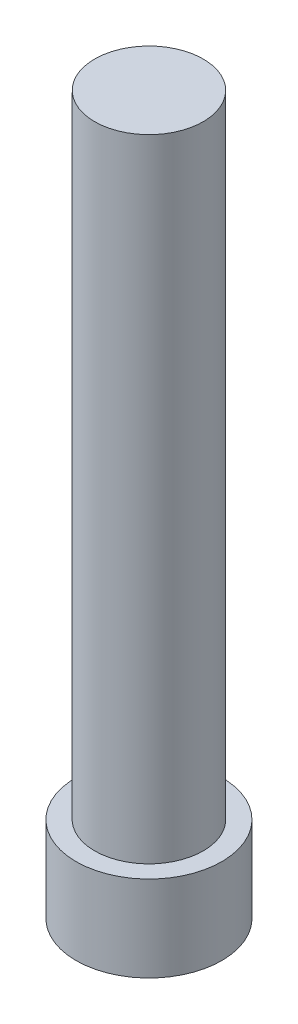
ISO-10303-21;
HEADER;
FILE_DESCRIPTION(('STEP AP214'),'2;1');
FILE_NAME('part.step','',(''),(''),'','','');
FILE_SCHEMA(('AUTOMOTIVE_DESIGN { 1 0 10303 214 1 1 1 1 }'));
ENDSEC;
DATA;
#1=APPLICATION_CONTEXT('core data for automotive mechanical design processes');
#2=APPLICATION_PROTOCOL_DEFINITION('international standard','automotive_design',2000,#1);
#3=PRODUCT_CONTEXT('',#1,'mechanical');
#4=PRODUCT('Part','Part','',(#3));
#5=PRODUCT_RELATED_PRODUCT_CATEGORY('part','',(#4));
#6=PRODUCT_DEFINITION_FORMATION('','',#4);
#7=PRODUCT_DEFINITION_CONTEXT('part definition',#1,'design');
#8=PRODUCT_DEFINITION('design','',#6,#7);
#9=PRODUCT_DEFINITION_SHAPE('','',#8);
#10=(LENGTH_UNIT() NAMED_UNIT(*) SI_UNIT(.MILLI.,.METRE.));
#11=(NAMED_UNIT(*) PLANE_ANGLE_UNIT() SI_UNIT($,.RADIAN.));
#12=(NAMED_UNIT(*) SI_UNIT($,.STERADIAN.) SOLID_ANGLE_UNIT());
#13=UNCERTAINTY_MEASURE_WITH_UNIT(LENGTH_MEASURE(1.E-05),#10,'distance_accuracy_value','');
#14=(GEOMETRIC_REPRESENTATION_CONTEXT(3) GLOBAL_UNCERTAINTY_ASSIGNED_CONTEXT((#13)) GLOBAL_UNIT_ASSIGNED_CONTEXT((#10,
#11,#12)) REPRESENTATION_CONTEXT('',''));
#15=CARTESIAN_POINT('',(0.,0.,0.));
#16=DIRECTION('',(0.,0.,1.));
#17=DIRECTION('',(1.,0.,0.));
#18=AXIS2_PLACEMENT_3D('',#15,#16,#17);
#19=CARTESIAN_POINT('',(0.,3.,0.));
#20=DIRECTION('',(0.,-1.,0.));
#21=DIRECTION('',(0.,0.,-1.));
#22=AXIS2_PLACEMENT_3D('',#19,#20,#21);
#23=CYLINDRICAL_SURFACE('',#22,2.55);
#24=CARTESIAN_POINT('',(0.,3.,0.));
#25=DIRECTION('',(0.,1.,0.));
#26=DIRECTION('',(0.,0.,1.));
#27=AXIS2_PLACEMENT_3D('',#24,#25,#26);
#28=CIRCLE('',#27,2.55);
#29=CARTESIAN_POINT('',(0.,3.,2.55));
#30=VERTEX_POINT('',#29);
#31=EDGE_CURVE('E45',#30,#30,#28,.T.);
#32=ORIENTED_EDGE('',*,*,#31,.F.);
#33=EDGE_LOOP('',(#32));
#34=FACE_BOUND('',#33,.T.);
#35=CARTESIAN_POINT('',(0.,0.,0.));
#36=DIRECTION('',(0.,1.,0.));
#37=DIRECTION('',(0.,0.,1.));
#38=AXIS2_PLACEMENT_3D('',#35,#36,#37);
#39=CIRCLE('',#38,2.55);
#40=CARTESIAN_POINT('',(0.,0.,2.55));
#41=VERTEX_POINT('',#40);
#42=EDGE_CURVE('E40',#41,#41,#39,.T.);
#43=ORIENTED_EDGE('',*,*,#42,.T.);
#44=EDGE_LOOP('',(#43));
#45=FACE_BOUND('',#44,.T.);
#46=ADVANCED_FACE('F37',(#34,#45),#23,.T.);
#47=CARTESIAN_POINT('',(0.,3.,0.));
#48=DIRECTION('',(0.,1.,0.));
#49=DIRECTION('',(0.,0.,1.));
#50=AXIS2_PLACEMENT_3D('',#47,#48,#49);
#51=PLANE('',#50);
#52=CARTESIAN_POINT('',(0.,3.,0.));
#53=DIRECTION('',(0.,1.,0.));
#54=DIRECTION('',(0.,0.,1.));
#55=AXIS2_PLACEMENT_3D('',#52,#53,#54);
#56=CIRCLE('',#55,1.9);
#57=CARTESIAN_POINT('',(0.,3.,1.9));
#58=VERTEX_POINT('',#57);
#59=EDGE_CURVE('E10',#58,#58,#56,.T.);
#60=ORIENTED_EDGE('',*,*,#59,.F.);
#61=EDGE_LOOP('',(#60));
#62=FACE_BOUND('',#61,.T.);
#63=ORIENTED_EDGE('',*,*,#31,.T.);
#64=EDGE_LOOP('',(#63));
#65=FACE_BOUND('',#64,.T.);
#66=ADVANCED_FACE('F65',(#62,#65),#51,.T.);
#67=CARTESIAN_POINT('',(0.,0.,0.));
#68=DIRECTION('',(0.,1.,0.));
#69=DIRECTION('',(0.,0.,1.));
#70=AXIS2_PLACEMENT_3D('',#67,#68,#69);
#71=PLANE('',#70);
#72=ORIENTED_EDGE('',*,*,#42,.F.);
#73=EDGE_LOOP('',(#72));
#74=FACE_BOUND('',#73,.T.);
#75=ADVANCED_FACE('F62',(#74),#71,.F.);
#76=CARTESIAN_POINT('',(0.,25.1,0.));
#77=DIRECTION('',(0.,-1.,0.));
#78=DIRECTION('',(0.,0.,-1.));
#79=AXIS2_PLACEMENT_3D('',#76,#77,#78);
#80=CYLINDRICAL_SURFACE('',#79,1.9);
#81=CARTESIAN_POINT('',(0.,25.1,0.));
#82=DIRECTION('',(0.,1.,0.));
#83=DIRECTION('',(0.,0.,1.));
#84=AXIS2_PLACEMENT_3D('',#81,#82,#83);
#85=CIRCLE('',#84,1.9);
#86=CARTESIAN_POINT('',(0.,25.1,1.9));
#87=VERTEX_POINT('',#86);
#88=EDGE_CURVE('E52',#87,#87,#85,.T.);
#89=ORIENTED_EDGE('',*,*,#88,.F.);
#90=EDGE_LOOP('',(#89));
#91=FACE_BOUND('',#90,.T.);
#92=ORIENTED_EDGE('',*,*,#59,.T.);
#93=EDGE_LOOP('',(#92));
#94=FACE_BOUND('',#93,.T.);
#95=ADVANCED_FACE('F64',(#91,#94),#80,.T.);
#96=CARTESIAN_POINT('',(0.,25.1,0.));
#97=DIRECTION('',(0.,1.,0.));
#98=DIRECTION('',(0.,0.,1.));
#99=AXIS2_PLACEMENT_3D('',#96,#97,#98);
#100=PLANE('',#99);
#101=ORIENTED_EDGE('',*,*,#88,.T.);
#102=EDGE_LOOP('',(#101));
#103=FACE_BOUND('',#102,.T.);
#104=ADVANCED_FACE('F70',(#103),#100,.T.);
#105=CLOSED_SHELL('',(#46,#66,#75,#95,#104));
#106=MANIFOLD_SOLID_BREP('B2',#105);
#107=ADVANCED_BREP_SHAPE_REPRESENTATION('',(#18,#106),#14);
#108=SHAPE_DEFINITION_REPRESENTATION(#9,#107);
ENDSEC;
END-ISO-10303-21;
